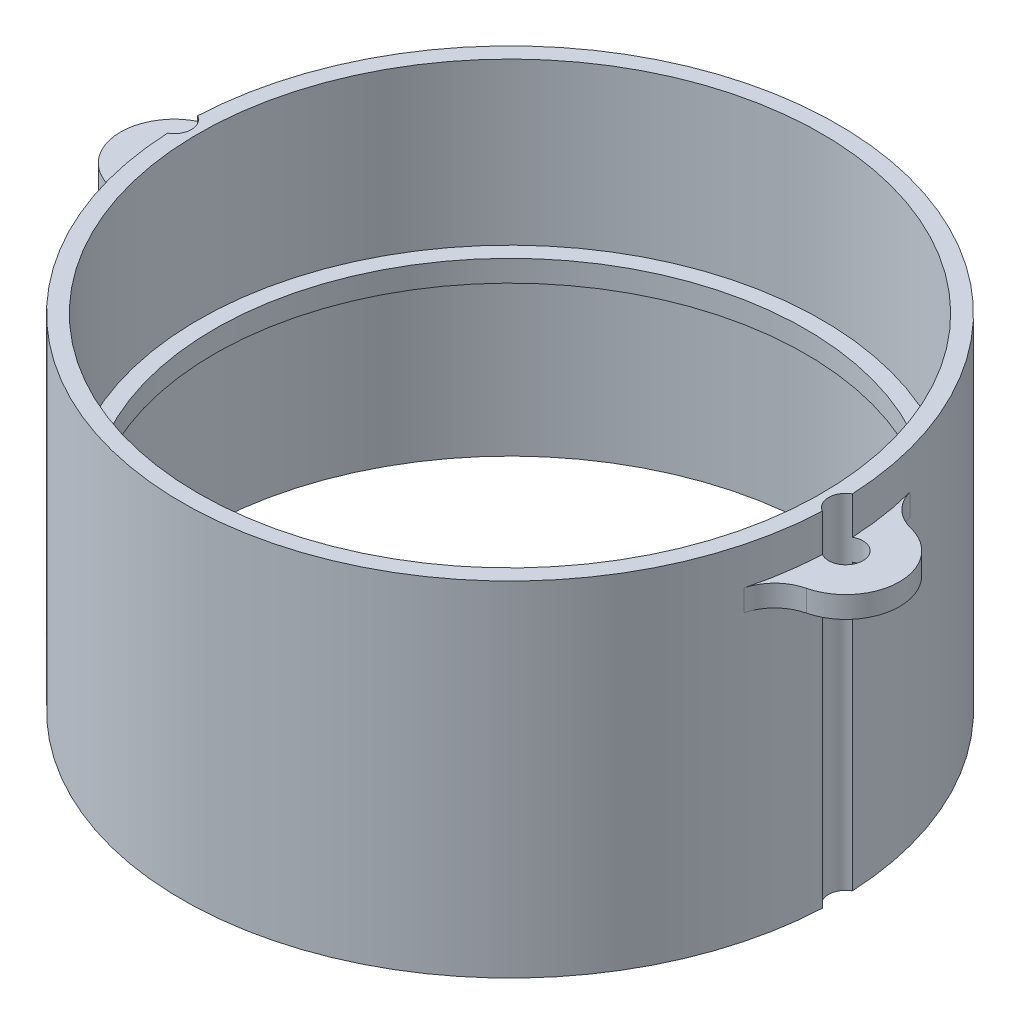
ISO-10303-21;
HEADER;
FILE_DESCRIPTION(('STEP AP214'),'2;1');
FILE_NAME('part.step','',(''),(''),'','','');
FILE_SCHEMA(('AUTOMOTIVE_DESIGN { 1 0 10303 214 1 1 1 1 }'));
ENDSEC;
DATA;
#1=APPLICATION_CONTEXT('core data for automotive mechanical design processes');
#2=APPLICATION_PROTOCOL_DEFINITION('international standard','automotive_design',2000,#1);
#3=PRODUCT_CONTEXT('',#1,'mechanical');
#4=PRODUCT('Part','Part','',(#3));
#5=PRODUCT_RELATED_PRODUCT_CATEGORY('part','',(#4));
#6=PRODUCT_DEFINITION_FORMATION('','',#4);
#7=PRODUCT_DEFINITION_CONTEXT('part definition',#1,'design');
#8=PRODUCT_DEFINITION('design','',#6,#7);
#9=PRODUCT_DEFINITION_SHAPE('','',#8);
#10=(LENGTH_UNIT() NAMED_UNIT(*) SI_UNIT(.MILLI.,.METRE.));
#11=(NAMED_UNIT(*) PLANE_ANGLE_UNIT() SI_UNIT($,.RADIAN.));
#12=(NAMED_UNIT(*) SI_UNIT($,.STERADIAN.) SOLID_ANGLE_UNIT());
#13=UNCERTAINTY_MEASURE_WITH_UNIT(LENGTH_MEASURE(1.E-05),#10,'distance_accuracy_value','');
#14=(GEOMETRIC_REPRESENTATION_CONTEXT(3) GLOBAL_UNCERTAINTY_ASSIGNED_CONTEXT((#13)) GLOBAL_UNIT_ASSIGNED_CONTEXT((#10,
#11,#12)) REPRESENTATION_CONTEXT('',''));
#15=CARTESIAN_POINT('',(0.,0.,0.));
#16=DIRECTION('',(0.,0.,1.));
#17=DIRECTION('',(1.,0.,0.));
#18=AXIS2_PLACEMENT_3D('',#15,#16,#17);
#19=CARTESIAN_POINT('',(0.,15.,0.));
#20=DIRECTION('',(0.,-1.,0.));
#21=DIRECTION('',(0.,0.,-1.00000000000001));
#22=AXIS2_PLACEMENT_3D('',#19,#20,#21);
#23=CYLINDRICAL_SURFACE('',#22,30.5);
#24=DIRECTION('',(0.,1.,0.));
#25=VECTOR('',#24,1.);
#26=CARTESIAN_POINT('',(30.46804,12.,1.39590062626249));
#27=LINE('',#26,#25);
#28=CARTESIAN_POINT('',(30.46804,32.,1.39590062626249));
#29=VERTEX_POINT('',#28);
#30=CARTESIAN_POINT('',(30.46804,28.5,1.39590062626249));
#31=VERTEX_POINT('',#30);
#32=EDGE_CURVE('E48',#29,#31,#27,.F.);
#33=ORIENTED_EDGE('',*,*,#32,.F.);
#34=CARTESIAN_POINT('',(0.,32.,0.));
#35=DIRECTION('',(0.,1.,0.));
#36=DIRECTION('',(0.,0.,1.00000000000001));
#37=AXIS2_PLACEMENT_3D('',#34,#35,#36);
#38=CIRCLE('',#37,30.5);
#39=CARTESIAN_POINT('',(-30.4680400000005,32.,1.39590062626294));
#40=VERTEX_POINT('',#39);
#41=EDGE_CURVE('E155',#40,#29,#38,.T.);
#42=ORIENTED_EDGE('',*,*,#41,.F.);
#43=DIRECTION('',(0.,1.,0.));
#44=VECTOR('',#43,1.);
#45=CARTESIAN_POINT('',(-30.4680400000005,12.,1.39590062626294));
#46=LINE('',#45,#44);
#47=CARTESIAN_POINT('',(-30.4680400000001,28.5,1.39590062626238));
#48=VERTEX_POINT('',#47);
#49=EDGE_CURVE('E214',#40,#48,#46,.F.);
#50=ORIENTED_EDGE('',*,*,#49,.T.);
#51=CARTESIAN_POINT('',(0.,28.5,0.));
#52=DIRECTION('',(0.,1.,0.));
#53=DIRECTION('',(0.,0.,1.00000000000001));
#54=AXIS2_PLACEMENT_3D('',#51,#52,#53);
#55=CIRCLE('',#54,30.5);
#56=CARTESIAN_POINT('',(-29.503666666667,28.5,7.73198895642213));
#57=VERTEX_POINT('',#56);
#58=EDGE_CURVE('E226',#48,#57,#55,.T.);
#59=ORIENTED_EDGE('',*,*,#58,.T.);
#60=DIRECTION('',(0.,-1.,0.));
#61=VECTOR('',#60,1.);
#62=CARTESIAN_POINT('',(-29.503666666667,28.5,7.73198895642213));
#63=LINE('',#62,#61);
#64=CARTESIAN_POINT('',(-29.503666666667,26.5,7.73198895642213));
#65=VERTEX_POINT('',#64);
#66=EDGE_CURVE('E208',#57,#65,#63,.T.);
#67=ORIENTED_EDGE('',*,*,#66,.T.);
#68=CARTESIAN_POINT('',(0.,26.5,0.));
#69=DIRECTION('',(0.,1.,0.));
#70=DIRECTION('',(0.,0.,1.00000000000001));
#71=AXIS2_PLACEMENT_3D('',#68,#69,#70);
#72=CIRCLE('',#71,30.5);
#73=CARTESIAN_POINT('',(-30.4680400000001,26.5,1.39590062626238));
#74=VERTEX_POINT('',#73);
#75=EDGE_CURVE('E197',#74,#65,#72,.T.);
#76=ORIENTED_EDGE('',*,*,#75,.F.);
#77=CARTESIAN_POINT('',(-30.4680400000005,0.,1.39590062626294));
#78=VERTEX_POINT('',#77);
#79=EDGE_CURVE('E205',#74,#78,#46,.F.);
#80=ORIENTED_EDGE('',*,*,#79,.T.);
#81=CARTESIAN_POINT('',(0.,0.,0.));
#82=DIRECTION('',(0.,1.,0.));
#83=DIRECTION('',(0.,0.,1.00000000000001));
#84=AXIS2_PLACEMENT_3D('',#81,#82,#83);
#85=CIRCLE('',#84,30.5);
#86=CARTESIAN_POINT('',(30.46804,0.,1.39590062626249));
#87=VERTEX_POINT('',#86);
#88=EDGE_CURVE('E189',#78,#87,#85,.T.);
#89=ORIENTED_EDGE('',*,*,#88,.T.);
#90=CARTESIAN_POINT('',(30.46804,26.5,1.39590062626249));
#91=VERTEX_POINT('',#90);
#92=EDGE_CURVE('E160',#91,#87,#27,.F.);
#93=ORIENTED_EDGE('',*,*,#92,.F.);
#94=CARTESIAN_POINT('',(0.,26.5,0.));
#95=DIRECTION('',(0.,-1.,0.));
#96=DIRECTION('',(0.,0.,1.00000000000001));
#97=AXIS2_PLACEMENT_3D('',#94,#95,#96);
#98=CIRCLE('',#97,30.5);
#99=CARTESIAN_POINT('',(29.5036666666667,26.5,7.73198895642135));
#100=VERTEX_POINT('',#99);
#101=EDGE_CURVE('E158',#91,#100,#98,.T.);
#102=ORIENTED_EDGE('',*,*,#101,.T.);
#103=DIRECTION('',(0.,-1.,0.));
#104=VECTOR('',#103,1.);
#105=CARTESIAN_POINT('',(29.5036666666667,28.5,7.73198895642135));
#106=LINE('',#105,#104);
#107=CARTESIAN_POINT('',(29.5036666666667,28.5,7.73198895642135));
#108=VERTEX_POINT('',#107);
#109=EDGE_CURVE('E265',#108,#100,#106,.T.);
#110=ORIENTED_EDGE('',*,*,#109,.F.);
#111=CARTESIAN_POINT('',(0.,28.5,0.));
#112=DIRECTION('',(0.,-1.,0.));
#113=DIRECTION('',(0.,0.,1.00000000000001));
#114=AXIS2_PLACEMENT_3D('',#111,#112,#113);
#115=CIRCLE('',#114,30.5);
#116=EDGE_CURVE('E157',#31,#108,#115,.T.);
#117=ORIENTED_EDGE('',*,*,#116,.F.);
#118=EDGE_LOOP('',(#33,#42,#50,#59,#67,#76,#80,#89,#93,#102,#110,#117));
#119=FACE_BOUND('',#118,.T.);
#120=ADVANCED_FACE('F34',(#119),#23,.T.);
#121=DIRECTION('',(0.,1.,0.));
#122=VECTOR('',#121,1.);
#123=CARTESIAN_POINT('',(30.4680400000002,12.,-1.39590062626249));
#124=LINE('',#123,#122);
#125=CARTESIAN_POINT('',(30.4680400000002,0.,-1.39590062626249));
#126=VERTEX_POINT('',#125);
#127=CARTESIAN_POINT('',(30.4680400000001,26.5,-1.39590062626238));
#128=VERTEX_POINT('',#127);
#129=EDGE_CURVE('E55',#126,#128,#124,.T.);
#130=ORIENTED_EDGE('',*,*,#129,.F.);
#131=CARTESIAN_POINT('',(-30.4680400000001,0.,-1.39590062626249));
#132=VERTEX_POINT('',#131);
#133=EDGE_CURVE('E188',#126,#132,#85,.T.);
#134=ORIENTED_EDGE('',*,*,#133,.T.);
#135=DIRECTION('',(0.,1.,0.));
#136=VECTOR('',#135,1.);
#137=CARTESIAN_POINT('',(-30.4680400000001,12.,-1.39590062626249));
#138=LINE('',#137,#136);
#139=CARTESIAN_POINT('',(-30.4680400000001,26.5,-1.39590062626249));
#140=VERTEX_POINT('',#139);
#141=EDGE_CURVE('E216',#132,#140,#138,.T.);
#142=ORIENTED_EDGE('',*,*,#141,.T.);
#143=CARTESIAN_POINT('',(-29.5036666666671,26.5,-7.73198895642146));
#144=VERTEX_POINT('',#143);
#145=EDGE_CURVE('E200',#144,#140,#72,.T.);
#146=ORIENTED_EDGE('',*,*,#145,.F.);
#147=DIRECTION('',(0.,-1.,0.));
#148=VECTOR('',#147,1.);
#149=CARTESIAN_POINT('',(-29.5036666666671,28.5,-7.73198895642146));
#150=LINE('',#149,#148);
#151=CARTESIAN_POINT('',(-29.5036666666671,28.5,-7.73198895642146));
#152=VERTEX_POINT('',#151);
#153=EDGE_CURVE('E179',#152,#144,#150,.T.);
#154=ORIENTED_EDGE('',*,*,#153,.F.);
#155=CARTESIAN_POINT('',(-30.4680400000001,28.5,-1.39590062626249));
#156=VERTEX_POINT('',#155);
#157=EDGE_CURVE('E254',#152,#156,#55,.T.);
#158=ORIENTED_EDGE('',*,*,#157,.T.);
#159=CARTESIAN_POINT('',(-30.4680400000001,32.,-1.39590062626249));
#160=VERTEX_POINT('',#159);
#161=EDGE_CURVE('E210',#156,#160,#138,.T.);
#162=ORIENTED_EDGE('',*,*,#161,.T.);
#163=CARTESIAN_POINT('',(30.4680400000002,32.,-1.39590062626249));
#164=VERTEX_POINT('',#163);
#165=EDGE_CURVE('E167',#164,#160,#38,.T.);
#166=ORIENTED_EDGE('',*,*,#165,.F.);
#167=CARTESIAN_POINT('',(30.4680400000001,28.5,-1.39590062626238));
#168=VERTEX_POINT('',#167);
#169=EDGE_CURVE('E146',#168,#164,#124,.T.);
#170=ORIENTED_EDGE('',*,*,#169,.F.);
#171=CARTESIAN_POINT('',(29.5036666666667,28.5,-7.73198895642124));
#172=VERTEX_POINT('',#171);
#173=EDGE_CURVE('E295',#172,#168,#115,.T.);
#174=ORIENTED_EDGE('',*,*,#173,.F.);
#175=DIRECTION('',(0.,-1.,0.));
#176=VECTOR('',#175,1.);
#177=CARTESIAN_POINT('',(29.5036666666666,28.5,-7.73198895642135));
#178=LINE('',#177,#176);
#179=CARTESIAN_POINT('',(29.5036666666666,26.5,-7.73198895642135));
#180=VERTEX_POINT('',#179);
#181=EDGE_CURVE('E272',#172,#180,#178,.T.);
#182=ORIENTED_EDGE('',*,*,#181,.T.);
#183=EDGE_CURVE('E284',#180,#128,#98,.T.);
#184=ORIENTED_EDGE('',*,*,#183,.T.);
#185=EDGE_LOOP('',(#130,#134,#142,#146,#154,#158,#162,#166,#170,#174,#182,#184));
#186=FACE_BOUND('',#185,.T.);
#187=ADVANCED_FACE('F309',(#186),#23,.T.);
#188=CARTESIAN_POINT('',(0.,17.,0.));
#189=DIRECTION('',(0.,1.,0.));
#190=DIRECTION('',(0.,0.,1.00000000000001));
#191=AXIS2_PLACEMENT_3D('',#188,#189,#190);
#192=PLANE('',#191);
#193=CARTESIAN_POINT('',(0.,17.,0.));
#194=DIRECTION('',(0.,1.,0.));
#195=DIRECTION('',(0.,0.,1.00000000000001));
#196=AXIS2_PLACEMENT_3D('',#193,#194,#195);
#197=CIRCLE('',#196,27.5);
#198=CARTESIAN_POINT('',(0.,17.,27.5000000000001));
#199=VERTEX_POINT('',#198);
#200=EDGE_CURVE('E170',#199,#199,#197,.T.);
#201=ORIENTED_EDGE('',*,*,#200,.F.);
#202=EDGE_LOOP('',(#201));
#203=FACE_BOUND('',#202,.T.);
#204=CARTESIAN_POINT('',(0.,17.,0.));
#205=DIRECTION('',(0.,1.,0.));
#206=DIRECTION('',(0.,0.,1.00000000000001));
#207=AXIS2_PLACEMENT_3D('',#204,#205,#206);
#208=CIRCLE('',#207,29.);
#209=CARTESIAN_POINT('',(0.,17.,29.0000000000002));
#210=VERTEX_POINT('',#209);
#211=EDGE_CURVE('E176',#210,#210,#208,.T.);
#212=ORIENTED_EDGE('',*,*,#211,.T.);
#213=EDGE_LOOP('',(#212));
#214=FACE_BOUND('',#213,.T.);
#215=ADVANCED_FACE('F329',(#203,#214),#192,.T.);
#216=CARTESIAN_POINT('',(0.,0.,0.));
#217=DIRECTION('',(0.,1.,0.));
#218=DIRECTION('',(0.,0.,1.00000000000001));
#219=AXIS2_PLACEMENT_3D('',#216,#217,#218);
#220=PLANE('',#219);
#221=CARTESIAN_POINT('',(31.2499999999999,0.,-1.11022302462516E-13));
#222=DIRECTION('',(0.,1.,0.));
#223=DIRECTION('',(0.,0.,1.00000000000001));
#224=AXIS2_PLACEMENT_3D('',#221,#222,#223);
#225=CIRCLE('',#224,1.6);
#226=EDGE_CURVE('E300',#87,#126,#225,.F.);
#227=ORIENTED_EDGE('',*,*,#226,.F.);
#228=ORIENTED_EDGE('',*,*,#88,.F.);
#229=CARTESIAN_POINT('',(-31.2500000000003,0.,8.88178419700125E-13));
#230=DIRECTION('',(0.,1.,0.));
#231=DIRECTION('',(0.,0.,1.00000000000001));
#232=AXIS2_PLACEMENT_3D('',#229,#230,#231);
#233=CIRCLE('',#232,1.6);
#234=EDGE_CURVE('E260',#78,#132,#233,.T.);
#235=ORIENTED_EDGE('',*,*,#234,.T.);
#236=ORIENTED_EDGE('',*,*,#133,.F.);
#237=EDGE_LOOP('',(#227,#228,#235,#236));
#238=FACE_BOUND('',#237,.T.);
#239=CARTESIAN_POINT('',(0.,0.,0.));
#240=DIRECTION('',(0.,1.,0.));
#241=DIRECTION('',(0.,0.,1.00000000000001));
#242=AXIS2_PLACEMENT_3D('',#239,#240,#241);
#243=CIRCLE('',#242,29.);
#244=CARTESIAN_POINT('',(0.,0.,29.0000000000002));
#245=VERTEX_POINT('',#244);
#246=EDGE_CURVE('E185',#245,#245,#243,.T.);
#247=ORIENTED_EDGE('',*,*,#246,.T.);
#248=EDGE_LOOP('',(#247));
#249=FACE_BOUND('',#248,.T.);
#250=ADVANCED_FACE('F307',(#238,#249),#220,.F.);
#251=CARTESIAN_POINT('',(0.,15.,0.));
#252=DIRECTION('',(0.,-1.,0.));
#253=DIRECTION('',(0.,0.,-1.00000000000001));
#254=AXIS2_PLACEMENT_3D('',#251,#252,#253);
#255=CYLINDRICAL_SURFACE('',#254,29.);
#256=CARTESIAN_POINT('',(0.,15.,0.));
#257=DIRECTION('',(0.,1.,0.));
#258=DIRECTION('',(0.,0.,1.00000000000001));
#259=AXIS2_PLACEMENT_3D('',#256,#257,#258);
#260=CIRCLE('',#259,29.);
#261=CARTESIAN_POINT('',(0.,15.,29.0000000000002));
#262=VERTEX_POINT('',#261);
#263=EDGE_CURVE('E181',#262,#262,#260,.T.);
#264=ORIENTED_EDGE('',*,*,#263,.T.);
#265=EDGE_LOOP('',(#264));
#266=FACE_BOUND('',#265,.T.);
#267=ORIENTED_EDGE('',*,*,#246,.F.);
#268=EDGE_LOOP('',(#267));
#269=FACE_BOUND('',#268,.T.);
#270=ADVANCED_FACE('F338',(#266,#269),#255,.F.);
#271=CARTESIAN_POINT('',(0.,15.,0.));
#272=DIRECTION('',(0.,1.,0.));
#273=DIRECTION('',(0.,0.,1.00000000000001));
#274=AXIS2_PLACEMENT_3D('',#271,#272,#273);
#275=PLANE('',#274);
#276=CARTESIAN_POINT('',(0.,15.,0.));
#277=DIRECTION('',(0.,1.,0.));
#278=DIRECTION('',(0.,0.,1.00000000000001));
#279=AXIS2_PLACEMENT_3D('',#276,#277,#278);
#280=CIRCLE('',#279,27.5);
#281=CARTESIAN_POINT('',(0.,15.,27.5000000000001));
#282=VERTEX_POINT('',#281);
#283=EDGE_CURVE('E166',#282,#282,#280,.T.);
#284=ORIENTED_EDGE('',*,*,#283,.T.);
#285=EDGE_LOOP('',(#284));
#286=FACE_BOUND('',#285,.T.);
#287=ORIENTED_EDGE('',*,*,#263,.F.);
#288=EDGE_LOOP('',(#287));
#289=FACE_BOUND('',#288,.T.);
#290=ADVANCED_FACE('F345',(#286,#289),#275,.F.);
#291=CARTESIAN_POINT('',(0.,17.,0.));
#292=DIRECTION('',(0.,-1.,0.));
#293=DIRECTION('',(0.,0.,-1.00000000000001));
#294=AXIS2_PLACEMENT_3D('',#291,#292,#293);
#295=CYLINDRICAL_SURFACE('',#294,27.5);
#296=ORIENTED_EDGE('',*,*,#200,.T.);
#297=EDGE_LOOP('',(#296));
#298=FACE_BOUND('',#297,.T.);
#299=ORIENTED_EDGE('',*,*,#283,.F.);
#300=EDGE_LOOP('',(#299));
#301=FACE_BOUND('',#300,.T.);
#302=ADVANCED_FACE('F343',(#298,#301),#295,.F.);
#303=CARTESIAN_POINT('',(0.,32.,0.));
#304=DIRECTION('',(0.,-1.,0.));
#305=DIRECTION('',(0.,0.,-1.00000000000001));
#306=AXIS2_PLACEMENT_3D('',#303,#304,#305);
#307=CYLINDRICAL_SURFACE('',#306,29.);
#308=CARTESIAN_POINT('',(0.,32.,0.));
#309=DIRECTION('',(0.,1.,0.));
#310=DIRECTION('',(0.,0.,1.00000000000001));
#311=AXIS2_PLACEMENT_3D('',#308,#309,#310);
#312=CIRCLE('',#311,29.);
#313=CARTESIAN_POINT('',(0.,32.,29.0000000000002));
#314=VERTEX_POINT('',#313);
#315=EDGE_CURVE('E172',#314,#314,#312,.T.);
#316=ORIENTED_EDGE('',*,*,#315,.T.);
#317=EDGE_LOOP('',(#316));
#318=FACE_BOUND('',#317,.T.);
#319=ORIENTED_EDGE('',*,*,#211,.F.);
#320=EDGE_LOOP('',(#319));
#321=FACE_BOUND('',#320,.T.);
#322=ADVANCED_FACE('F369',(#318,#321),#307,.F.);
#323=CARTESIAN_POINT('',(0.,32.,0.));
#324=DIRECTION('',(0.,1.,0.));
#325=DIRECTION('',(0.,0.,1.00000000000001));
#326=AXIS2_PLACEMENT_3D('',#323,#324,#325);
#327=PLANE('',#326);
#328=ORIENTED_EDGE('',*,*,#41,.T.);
#329=CARTESIAN_POINT('',(31.2499999999999,32.,-1.11022302462516E-13));
#330=DIRECTION('',(0.,-1.,0.));
#331=DIRECTION('',(0.,0.,1.00000000000001));
#332=AXIS2_PLACEMENT_3D('',#329,#330,#331);
#333=CIRCLE('',#332,1.6);
#334=EDGE_CURVE('E143',#29,#164,#333,.T.);
#335=ORIENTED_EDGE('',*,*,#334,.T.);
#336=ORIENTED_EDGE('',*,*,#165,.T.);
#337=CARTESIAN_POINT('',(-31.2500000000003,32.,8.88178419700125E-13));
#338=DIRECTION('',(0.,1.,0.));
#339=DIRECTION('',(0.,0.,1.00000000000001));
#340=AXIS2_PLACEMENT_3D('',#337,#338,#339);
#341=CIRCLE('',#340,1.6);
#342=EDGE_CURVE('E165',#40,#160,#341,.T.);
#343=ORIENTED_EDGE('',*,*,#342,.F.);
#344=EDGE_LOOP('',(#328,#335,#336,#343));
#345=FACE_BOUND('',#344,.T.);
#346=ORIENTED_EDGE('',*,*,#315,.F.);
#347=EDGE_LOOP('',(#346));
#348=FACE_BOUND('',#347,.T.);
#349=ADVANCED_FACE('F162',(#345,#348),#327,.T.);
#350=CARTESIAN_POINT('',(-33.3730000000005,28.5,-8.74602029496696));
#351=DIRECTION('',(0.,-1.,0.));
#352=DIRECTION('',(0.,0.,-1.00000000000001));
#353=AXIS2_PLACEMENT_3D('',#350,#351,#352);
#354=CYLINDRICAL_SURFACE('',#353,4.);
#355=CARTESIAN_POINT('',(-33.3730000000005,26.5,-8.74602029496696));
#356=DIRECTION('',(0.,1.,0.));
#357=DIRECTION('',(0.,0.,1.00000000000001));
#358=AXIS2_PLACEMENT_3D('',#355,#356,#357);
#359=CIRCLE('',#358,4.);
#360=CARTESIAN_POINT('',(-32.4294444444445,26.5,-4.85890016387136));
#361=VERTEX_POINT('',#360);
#362=EDGE_CURVE('E212',#361,#144,#359,.T.);
#363=ORIENTED_EDGE('',*,*,#362,.F.);
#364=DIRECTION('',(0.,-1.,0.));
#365=VECTOR('',#364,1.);
#366=CARTESIAN_POINT('',(-32.4294444444445,28.5,-4.85890016387136));
#367=LINE('',#366,#365);
#368=CARTESIAN_POINT('',(-32.4294444444445,28.5,-4.85890016387136));
#369=VERTEX_POINT('',#368);
#370=EDGE_CURVE('E231',#369,#361,#367,.T.);
#371=ORIENTED_EDGE('',*,*,#370,.F.);
#372=CARTESIAN_POINT('',(-33.3730000000005,28.5,-8.74602029496696));
#373=DIRECTION('',(0.,1.,0.));
#374=DIRECTION('',(0.,0.,1.00000000000001));
#375=AXIS2_PLACEMENT_3D('',#372,#373,#374);
#376=CIRCLE('',#375,4.);
#377=EDGE_CURVE('E238',#369,#152,#376,.T.);
#378=ORIENTED_EDGE('',*,*,#377,.T.);
#379=ORIENTED_EDGE('',*,*,#153,.T.);
#380=EDGE_LOOP('',(#363,#371,#378,#379));
#381=FACE_BOUND('',#380,.T.);
#382=ADVANCED_FACE('F236',(#381),#354,.F.);
#383=CARTESIAN_POINT('',(-31.2500000000003,28.5,8.88178419700125E-13));
#384=DIRECTION('',(0.,-1.,0.));
#385=DIRECTION('',(0.,0.,-1.00000000000001));
#386=AXIS2_PLACEMENT_3D('',#383,#384,#385);
#387=CYLINDRICAL_SURFACE('',#386,5.);
#388=CARTESIAN_POINT('',(-31.2500000000003,26.5,8.88178419700125E-13));
#389=DIRECTION('',(0.,1.,0.));
#390=DIRECTION('',(0.,0.,1.00000000000001));
#391=AXIS2_PLACEMENT_3D('',#388,#389,#390);
#392=CIRCLE('',#391,5.);
#393=CARTESIAN_POINT('',(-32.4294444444447,26.5,4.85890016387125));
#394=VERTEX_POINT('',#393);
#395=EDGE_CURVE('E222',#361,#394,#392,.T.);
#396=ORIENTED_EDGE('',*,*,#395,.T.);
#397=DIRECTION('',(0.,-1.,0.));
#398=VECTOR('',#397,1.);
#399=CARTESIAN_POINT('',(-32.4294444444447,28.5,4.85890016387125));
#400=LINE('',#399,#398);
#401=CARTESIAN_POINT('',(-32.4294444444447,28.5,4.85890016387125));
#402=VERTEX_POINT('',#401);
#403=EDGE_CURVE('E228',#402,#394,#400,.T.);
#404=ORIENTED_EDGE('',*,*,#403,.F.);
#405=CARTESIAN_POINT('',(-31.2500000000003,28.5,8.88178419700125E-13));
#406=DIRECTION('',(0.,1.,0.));
#407=DIRECTION('',(0.,0.,1.00000000000001));
#408=AXIS2_PLACEMENT_3D('',#405,#406,#407);
#409=CIRCLE('',#408,5.);
#410=EDGE_CURVE('E253',#369,#402,#409,.T.);
#411=ORIENTED_EDGE('',*,*,#410,.F.);
#412=ORIENTED_EDGE('',*,*,#370,.T.);
#413=EDGE_LOOP('',(#396,#404,#411,#412));
#414=FACE_BOUND('',#413,.T.);
#415=ADVANCED_FACE('F245',(#414),#387,.T.);
#416=CARTESIAN_POINT('',(-33.3730000000005,28.5,8.74602029496929));
#417=DIRECTION('',(0.,-1.,0.));
#418=DIRECTION('',(0.,0.,-1.00000000000001));
#419=AXIS2_PLACEMENT_3D('',#416,#417,#418);
#420=CYLINDRICAL_SURFACE('',#419,4.);
#421=CARTESIAN_POINT('',(-33.3730000000005,26.5,8.74602029496929));
#422=DIRECTION('',(0.,1.,0.));
#423=DIRECTION('',(0.,0.,1.00000000000001));
#424=AXIS2_PLACEMENT_3D('',#421,#422,#423);
#425=CIRCLE('',#424,4.);
#426=EDGE_CURVE('E224',#394,#65,#425,.F.);
#427=ORIENTED_EDGE('',*,*,#426,.T.);
#428=ORIENTED_EDGE('',*,*,#66,.F.);
#429=CARTESIAN_POINT('',(-33.3730000000005,28.5,8.74602029496929));
#430=DIRECTION('',(0.,1.,0.));
#431=DIRECTION('',(0.,0.,1.00000000000001));
#432=AXIS2_PLACEMENT_3D('',#429,#430,#431);
#433=CIRCLE('',#432,4.);
#434=EDGE_CURVE('E219',#402,#57,#433,.F.);
#435=ORIENTED_EDGE('',*,*,#434,.F.);
#436=ORIENTED_EDGE('',*,*,#403,.T.);
#437=EDGE_LOOP('',(#427,#428,#435,#436));
#438=FACE_BOUND('',#437,.T.);
#439=ADVANCED_FACE('F249',(#438),#420,.F.);
#440=CARTESIAN_POINT('',(0.,28.5,0.));
#441=DIRECTION('',(0.,1.,0.));
#442=DIRECTION('',(0.,0.,1.00000000000001));
#443=AXIS2_PLACEMENT_3D('',#440,#441,#442);
#444=PLANE('',#443);
#445=CARTESIAN_POINT('',(-31.2500000000003,28.5,8.88178419700125E-13));
#446=DIRECTION('',(0.,1.,0.));
#447=DIRECTION('',(0.,0.,1.00000000000001));
#448=AXIS2_PLACEMENT_3D('',#445,#446,#447);
#449=CIRCLE('',#448,1.6);
#450=EDGE_CURVE('E258',#156,#48,#449,.T.);
#451=ORIENTED_EDGE('',*,*,#450,.F.);
#452=ORIENTED_EDGE('',*,*,#157,.F.);
#453=ORIENTED_EDGE('',*,*,#377,.F.);
#454=ORIENTED_EDGE('',*,*,#410,.T.);
#455=ORIENTED_EDGE('',*,*,#434,.T.);
#456=ORIENTED_EDGE('',*,*,#58,.F.);
#457=EDGE_LOOP('',(#451,#452,#453,#454,#455,#456));
#458=FACE_BOUND('',#457,.T.);
#459=ADVANCED_FACE('F316',(#458),#444,.T.);
#460=CARTESIAN_POINT('',(0.,26.5,0.));
#461=DIRECTION('',(0.,1.,0.));
#462=DIRECTION('',(0.,0.,1.00000000000001));
#463=AXIS2_PLACEMENT_3D('',#460,#461,#462);
#464=PLANE('',#463);
#465=ORIENTED_EDGE('',*,*,#145,.T.);
#466=CARTESIAN_POINT('',(-31.2500000000003,26.5,8.88178419700125E-13));
#467=DIRECTION('',(0.,1.,0.));
#468=DIRECTION('',(0.,0.,1.00000000000001));
#469=AXIS2_PLACEMENT_3D('',#466,#467,#468);
#470=CIRCLE('',#469,1.6);
#471=EDGE_CURVE('E41',#140,#74,#470,.T.);
#472=ORIENTED_EDGE('',*,*,#471,.T.);
#473=ORIENTED_EDGE('',*,*,#75,.T.);
#474=ORIENTED_EDGE('',*,*,#426,.F.);
#475=ORIENTED_EDGE('',*,*,#395,.F.);
#476=ORIENTED_EDGE('',*,*,#362,.T.);
#477=EDGE_LOOP('',(#465,#472,#473,#474,#475,#476));
#478=FACE_BOUND('',#477,.T.);
#479=ADVANCED_FACE('F195',(#478),#464,.F.);
#480=CARTESIAN_POINT('',(-31.2500000000003,-8.00000000000001,8.88178419700125E-13));
#481=DIRECTION('',(0.,1.,0.));
#482=DIRECTION('',(0.,0.,1.00000000000001));
#483=AXIS2_PLACEMENT_3D('',#480,#481,#482);
#484=CYLINDRICAL_SURFACE('',#483,1.6);
#485=ORIENTED_EDGE('',*,*,#79,.F.);
#486=ORIENTED_EDGE('',*,*,#471,.F.);
#487=ORIENTED_EDGE('',*,*,#141,.F.);
#488=ORIENTED_EDGE('',*,*,#234,.F.);
#489=EDGE_LOOP('',(#485,#486,#487,#488));
#490=FACE_BOUND('',#489,.T.);
#491=ORIENTED_EDGE('',*,*,#450,.T.);
#492=ORIENTED_EDGE('',*,*,#49,.F.);
#493=ORIENTED_EDGE('',*,*,#342,.T.);
#494=ORIENTED_EDGE('',*,*,#161,.F.);
#495=EDGE_LOOP('',(#491,#492,#493,#494));
#496=FACE_BOUND('',#495,.T.);
#497=ADVANCED_FACE('F310',(#490,#496),#484,.F.);
#498=CARTESIAN_POINT('',(33.3730000000002,28.5,8.74602029496852));
#499=DIRECTION('',(0.,-1.,0.));
#500=DIRECTION('',(0.,0.,-1.00000000000001));
#501=AXIS2_PLACEMENT_3D('',#498,#499,#500);
#502=CYLINDRICAL_SURFACE('',#501,4.);
#503=CARTESIAN_POINT('',(33.3730000000002,26.5,8.74602029496852));
#504=DIRECTION('',(0.,-1.,0.));
#505=DIRECTION('',(0.,0.,1.00000000000001));
#506=AXIS2_PLACEMENT_3D('',#503,#504,#505);
#507=CIRCLE('',#506,4.);
#508=CARTESIAN_POINT('',(32.4294444444445,26.5,4.85890016387136));
#509=VERTEX_POINT('',#508);
#510=EDGE_CURVE('E281',#509,#100,#507,.F.);
#511=ORIENTED_EDGE('',*,*,#510,.F.);
#512=DIRECTION('',(0.,-1.,0.));
#513=VECTOR('',#512,1.);
#514=CARTESIAN_POINT('',(32.4294444444445,28.5,4.85890016387136));
#515=LINE('',#514,#513);
#516=CARTESIAN_POINT('',(32.4294444444445,28.5,4.85890016387136));
#517=VERTEX_POINT('',#516);
#518=EDGE_CURVE('E268',#517,#509,#515,.T.);
#519=ORIENTED_EDGE('',*,*,#518,.F.);
#520=CARTESIAN_POINT('',(33.3730000000002,28.5,8.74602029496852));
#521=DIRECTION('',(0.,-1.,0.));
#522=DIRECTION('',(0.,0.,1.00000000000001));
#523=AXIS2_PLACEMENT_3D('',#520,#521,#522);
#524=CIRCLE('',#523,4.);
#525=EDGE_CURVE('E292',#517,#108,#524,.F.);
#526=ORIENTED_EDGE('',*,*,#525,.T.);
#527=ORIENTED_EDGE('',*,*,#109,.T.);
#528=EDGE_LOOP('',(#511,#519,#526,#527));
#529=FACE_BOUND('',#528,.T.);
#530=ADVANCED_FACE('F313',(#529),#502,.F.);
#531=CARTESIAN_POINT('',(31.2499999999999,28.5,-1.11022302462516E-13));
#532=DIRECTION('',(0.,-1.,0.));
#533=DIRECTION('',(0.,0.,-1.00000000000001));
#534=AXIS2_PLACEMENT_3D('',#531,#532,#533);
#535=CYLINDRICAL_SURFACE('',#534,5.);
#536=CARTESIAN_POINT('',(31.2499999999999,26.5,-1.11022302462516E-13));
#537=DIRECTION('',(0.,-1.,0.));
#538=DIRECTION('',(0.,0.,1.00000000000001));
#539=AXIS2_PLACEMENT_3D('',#536,#537,#538);
#540=CIRCLE('',#539,5.);
#541=CARTESIAN_POINT('',(32.4294444444446,26.5,-4.85890016387136));
#542=VERTEX_POINT('',#541);
#543=EDGE_CURVE('E278',#542,#509,#540,.T.);
#544=ORIENTED_EDGE('',*,*,#543,.F.);
#545=DIRECTION('',(0.,-1.,0.));
#546=VECTOR('',#545,1.);
#547=CARTESIAN_POINT('',(32.4294444444446,28.5,-4.85890016387136));
#548=LINE('',#547,#546);
#549=CARTESIAN_POINT('',(32.4294444444446,28.5,-4.85890016387136));
#550=VERTEX_POINT('',#549);
#551=EDGE_CURVE('E270',#550,#542,#548,.T.);
#552=ORIENTED_EDGE('',*,*,#551,.F.);
#553=CARTESIAN_POINT('',(31.2499999999999,28.5,-1.11022302462516E-13));
#554=DIRECTION('',(0.,-1.,0.));
#555=DIRECTION('',(0.,0.,1.00000000000001));
#556=AXIS2_PLACEMENT_3D('',#553,#554,#555);
#557=CIRCLE('',#556,5.);
#558=EDGE_CURVE('E289',#550,#517,#557,.T.);
#559=ORIENTED_EDGE('',*,*,#558,.T.);
#560=ORIENTED_EDGE('',*,*,#518,.T.);
#561=EDGE_LOOP('',(#544,#552,#559,#560));
#562=FACE_BOUND('',#561,.T.);
#563=ADVANCED_FACE('F423',(#562),#535,.T.);
#564=CARTESIAN_POINT('',(33.373,28.5,-8.7460202949684));
#565=DIRECTION('',(0.,-1.,0.));
#566=DIRECTION('',(0.,0.,-1.00000000000001));
#567=AXIS2_PLACEMENT_3D('',#564,#565,#566);
#568=CYLINDRICAL_SURFACE('',#567,4.);
#569=CARTESIAN_POINT('',(33.373,26.5,-8.7460202949684));
#570=DIRECTION('',(0.,-1.,0.));
#571=DIRECTION('',(0.,0.,1.00000000000001));
#572=AXIS2_PLACEMENT_3D('',#569,#570,#571);
#573=CIRCLE('',#572,4.);
#574=EDGE_CURVE('E275',#542,#180,#573,.T.);
#575=ORIENTED_EDGE('',*,*,#574,.T.);
#576=ORIENTED_EDGE('',*,*,#181,.F.);
#577=CARTESIAN_POINT('',(33.373,28.5,-8.7460202949684));
#578=DIRECTION('',(0.,-1.,0.));
#579=DIRECTION('',(0.,0.,1.00000000000001));
#580=AXIS2_PLACEMENT_3D('',#577,#578,#579);
#581=CIRCLE('',#580,4.);
#582=EDGE_CURVE('E274',#550,#172,#581,.T.);
#583=ORIENTED_EDGE('',*,*,#582,.F.);
#584=ORIENTED_EDGE('',*,*,#551,.T.);
#585=EDGE_LOOP('',(#575,#576,#583,#584));
#586=FACE_BOUND('',#585,.T.);
#587=ADVANCED_FACE('F433',(#586),#568,.F.);
#588=CARTESIAN_POINT('',(0.,28.5,0.));
#589=DIRECTION('',(0.,1.,0.));
#590=DIRECTION('',(0.,0.,1.00000000000001));
#591=AXIS2_PLACEMENT_3D('',#588,#589,#590);
#592=PLANE('',#591);
#593=ORIENTED_EDGE('',*,*,#173,.T.);
#594=CARTESIAN_POINT('',(31.2499999999999,28.5,-1.11022302462516E-13));
#595=DIRECTION('',(0.,1.,0.));
#596=DIRECTION('',(0.,0.,1.00000000000001));
#597=AXIS2_PLACEMENT_3D('',#594,#595,#596);
#598=CIRCLE('',#597,1.6);
#599=EDGE_CURVE('E298',#168,#31,#598,.F.);
#600=ORIENTED_EDGE('',*,*,#599,.T.);
#601=ORIENTED_EDGE('',*,*,#116,.T.);
#602=ORIENTED_EDGE('',*,*,#525,.F.);
#603=ORIENTED_EDGE('',*,*,#558,.F.);
#604=ORIENTED_EDGE('',*,*,#582,.T.);
#605=EDGE_LOOP('',(#593,#600,#601,#602,#603,#604));
#606=FACE_BOUND('',#605,.T.);
#607=ADVANCED_FACE('F443',(#606),#592,.T.);
#608=CARTESIAN_POINT('',(0.,26.5,0.));
#609=DIRECTION('',(0.,1.,0.));
#610=DIRECTION('',(0.,0.,1.00000000000001));
#611=AXIS2_PLACEMENT_3D('',#608,#609,#610);
#612=PLANE('',#611);
#613=CARTESIAN_POINT('',(31.2499999999999,26.5,-1.11022302462516E-13));
#614=DIRECTION('',(0.,1.,0.));
#615=DIRECTION('',(0.,0.,1.00000000000001));
#616=AXIS2_PLACEMENT_3D('',#613,#614,#615);
#617=CIRCLE('',#616,1.6);
#618=EDGE_CURVE('E11',#128,#91,#617,.F.);
#619=ORIENTED_EDGE('',*,*,#618,.F.);
#620=ORIENTED_EDGE('',*,*,#183,.F.);
#621=ORIENTED_EDGE('',*,*,#574,.F.);
#622=ORIENTED_EDGE('',*,*,#543,.T.);
#623=ORIENTED_EDGE('',*,*,#510,.T.);
#624=ORIENTED_EDGE('',*,*,#101,.F.);
#625=EDGE_LOOP('',(#619,#620,#621,#622,#623,#624));
#626=FACE_BOUND('',#625,.T.);
#627=ADVANCED_FACE('F453',(#626),#612,.F.);
#628=CARTESIAN_POINT('',(31.2499999999999,-8.00000000000001,-1.11022302462516E-13));
#629=DIRECTION('',(0.,1.,0.));
#630=DIRECTION('',(0.,0.,1.00000000000001));
#631=AXIS2_PLACEMENT_3D('',#628,#629,#630);
#632=CYLINDRICAL_SURFACE('',#631,1.6);
#633=ORIENTED_EDGE('',*,*,#226,.T.);
#634=ORIENTED_EDGE('',*,*,#129,.T.);
#635=ORIENTED_EDGE('',*,*,#618,.T.);
#636=ORIENTED_EDGE('',*,*,#92,.T.);
#637=EDGE_LOOP('',(#633,#634,#635,#636));
#638=FACE_BOUND('',#637,.T.);
#639=ORIENTED_EDGE('',*,*,#32,.T.);
#640=ORIENTED_EDGE('',*,*,#599,.F.);
#641=ORIENTED_EDGE('',*,*,#169,.T.);
#642=ORIENTED_EDGE('',*,*,#334,.F.);
#643=EDGE_LOOP('',(#639,#640,#641,#642));
#644=FACE_BOUND('',#643,.T.);
#645=ADVANCED_FACE('F144',(#638,#644),#632,.F.);
#646=CLOSED_SHELL('',(#120,#187,#215,#250,#270,#290,#302,#322,#349,#382,#415,#439,#459,#479,
#497,#530,#563,#587,#607,#627,#645));
#647=MANIFOLD_SOLID_BREP('B2',#646);
#648=ADVANCED_BREP_SHAPE_REPRESENTATION('',(#18,#647),#14);
#649=SHAPE_DEFINITION_REPRESENTATION(#9,#648);
ENDSEC;
END-ISO-10303-21;
